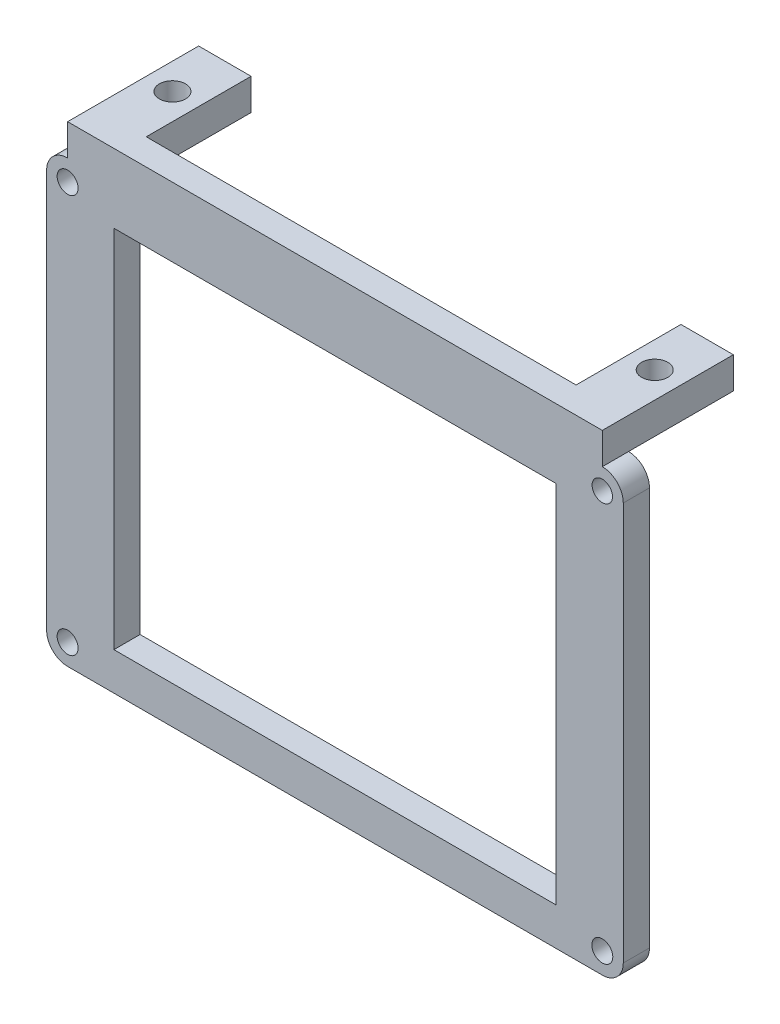
ISO-10303-21;
HEADER;
FILE_DESCRIPTION(('STEP AP214'),'2;1');
FILE_NAME('part.step','',(''),(''),'','','');
FILE_SCHEMA(('AUTOMOTIVE_DESIGN { 1 0 10303 214 1 1 1 1 }'));
ENDSEC;
DATA;
#1=APPLICATION_CONTEXT('core data for automotive mechanical design processes');
#2=APPLICATION_PROTOCOL_DEFINITION('international standard','automotive_design',2000,#1);
#3=PRODUCT_CONTEXT('',#1,'mechanical');
#4=PRODUCT('Part','Part','',(#3));
#5=PRODUCT_RELATED_PRODUCT_CATEGORY('part','',(#4));
#6=PRODUCT_DEFINITION_FORMATION('','',#4);
#7=PRODUCT_DEFINITION_CONTEXT('part definition',#1,'design');
#8=PRODUCT_DEFINITION('design','',#6,#7);
#9=PRODUCT_DEFINITION_SHAPE('','',#8);
#10=(LENGTH_UNIT() NAMED_UNIT(*) SI_UNIT(.MILLI.,.METRE.));
#11=(NAMED_UNIT(*) PLANE_ANGLE_UNIT() SI_UNIT($,.RADIAN.));
#12=(NAMED_UNIT(*) SI_UNIT($,.STERADIAN.) SOLID_ANGLE_UNIT());
#13=UNCERTAINTY_MEASURE_WITH_UNIT(LENGTH_MEASURE(1.E-05),#10,'distance_accuracy_value','');
#14=(GEOMETRIC_REPRESENTATION_CONTEXT(3) GLOBAL_UNCERTAINTY_ASSIGNED_CONTEXT((#13)) GLOBAL_UNIT_ASSIGNED_CONTEXT((#10,
#11,#12)) REPRESENTATION_CONTEXT('',''));
#15=CARTESIAN_POINT('',(0.,0.,0.));
#16=DIRECTION('',(0.,0.,1.));
#17=DIRECTION('',(1.,0.,0.));
#18=AXIS2_PLACEMENT_3D('',#15,#16,#17);
#19=CARTESIAN_POINT('',(67.9113573407202,23.2714681440443,5.));
#20=DIRECTION('',(0.,0.,-1.));
#21=DIRECTION('',(-1.,0.,0.));
#22=AXIS2_PLACEMENT_3D('',#19,#20,#21);
#23=PLANE('',#22);
#24=DIRECTION('',(-1.,0.,0.));
#25=VECTOR('',#24,1.);
#26=CARTESIAN_POINT('',(-25.261887482844,20.0825003663632,5.));
#27=LINE('',#26,#25);
#28=CARTESIAN_POINT('',(59.0846021642845,20.0825003663632,5.));
#29=VERTEX_POINT('',#28);
#30=CARTESIAN_POINT('',(-25.261887482844,20.0825003663632,5.));
#31=VERTEX_POINT('',#30);
#32=EDGE_CURVE('E177',#29,#31,#27,.T.);
#33=ORIENTED_EDGE('',*,*,#32,.F.);
#34=DIRECTION('',(0.,1.,0.));
#35=VECTOR('',#34,1.);
#36=CARTESIAN_POINT('',(59.0846021642845,20.0825003663632,5.));
#37=LINE('',#36,#35);
#38=CARTESIAN_POINT('',(59.0846021642845,-49.5395640782746,5.));
#39=VERTEX_POINT('',#38);
#40=EDGE_CURVE('E50',#39,#29,#37,.T.);
#41=ORIENTED_EDGE('',*,*,#40,.F.);
#42=DIRECTION('',(1.,0.,0.));
#43=VECTOR('',#42,1.);
#44=CARTESIAN_POINT('',(-25.261887482844,-49.5395640782746,5.));
#45=LINE('',#44,#43);
#46=CARTESIAN_POINT('',(-25.261887482844,-49.5395640782746,5.));
#47=VERTEX_POINT('',#46);
#48=EDGE_CURVE('E183',#47,#39,#45,.T.);
#49=ORIENTED_EDGE('',*,*,#48,.F.);
#50=DIRECTION('',(0.,-1.,0.));
#51=VECTOR('',#50,1.);
#52=CARTESIAN_POINT('',(-25.261887482844,20.0825003663632,5.));
#53=LINE('',#52,#51);
#54=EDGE_CURVE('E168',#31,#47,#53,.T.);
#55=ORIENTED_EDGE('',*,*,#54,.F.);
#56=EDGE_LOOP('',(#33,#41,#49,#55));
#57=FACE_BOUND('',#56,.T.);
#58=CARTESIAN_POINT('',(67.9113573407202,23.2714681440443,5.));
#59=DIRECTION('',(0.,0.,1.));
#60=DIRECTION('',(-1.,0.,0.));
#61=AXIS2_PLACEMENT_3D('',#58,#59,#60);
#62=CIRCLE('',#61,4.);
#63=CARTESIAN_POINT('',(71.9113573407202,23.2714681440443,5.));
#64=VERTEX_POINT('',#63);
#65=CARTESIAN_POINT('',(67.9113573407202,27.2714681440443,5.));
#66=VERTEX_POINT('',#65);
#67=EDGE_CURVE('E290',#64,#66,#62,.T.);
#68=ORIENTED_EDGE('',*,*,#67,.T.);
#69=DIRECTION('',(0.,-1.,0.));
#70=VECTOR('',#69,1.);
#71=CARTESIAN_POINT('',(67.9113573407202,33.2714681440443,5.));
#72=LINE('',#71,#70);
#73=CARTESIAN_POINT('',(67.9113573407202,33.2714681440443,5.));
#74=VERTEX_POINT('',#73);
#75=EDGE_CURVE('E258',#74,#66,#72,.T.);
#76=ORIENTED_EDGE('',*,*,#75,.F.);
#77=DIRECTION('',(1.,0.,0.));
#78=VECTOR('',#77,1.);
#79=CARTESIAN_POINT('',(0.,33.2714681440443,5.));
#80=LINE('',#79,#78);
#81=CARTESIAN_POINT('',(-34.0886426592797,33.2714681440443,5.));
#82=VERTEX_POINT('',#81);
#83=EDGE_CURVE('E200',#82,#74,#80,.T.);
#84=ORIENTED_EDGE('',*,*,#83,.F.);
#85=DIRECTION('',(0.,-1.,0.));
#86=VECTOR('',#85,1.);
#87=CARTESIAN_POINT('',(-34.0886426592797,33.2714681440443,5.));
#88=LINE('',#87,#86);
#89=CARTESIAN_POINT('',(-34.0886426592797,27.2714681440443,5.));
#90=VERTEX_POINT('',#89);
#91=EDGE_CURVE('E260',#82,#90,#88,.T.);
#92=ORIENTED_EDGE('',*,*,#91,.T.);
#93=CARTESIAN_POINT('',(-34.0886426592798,23.2714681440443,5.));
#94=DIRECTION('',(0.,0.,1.));
#95=DIRECTION('',(1.,0.,0.));
#96=AXIS2_PLACEMENT_3D('',#93,#94,#95);
#97=CIRCLE('',#96,4.);
#98=CARTESIAN_POINT('',(-38.0886426592798,23.2714681440443,5.));
#99=VERTEX_POINT('',#98);
#100=EDGE_CURVE('E293',#90,#99,#97,.T.);
#101=ORIENTED_EDGE('',*,*,#100,.T.);
#102=DIRECTION('',(0.,-1.,0.));
#103=VECTOR('',#102,1.);
#104=CARTESIAN_POINT('',(-38.0886426592798,23.2714681440443,5.));
#105=LINE('',#104,#103);
#106=CARTESIAN_POINT('',(-38.0886426592798,-52.7285318559557,5.));
#107=VERTEX_POINT('',#106);
#108=EDGE_CURVE('E296',#99,#107,#105,.T.);
#109=ORIENTED_EDGE('',*,*,#108,.T.);
#110=CARTESIAN_POINT('',(-34.0886426592798,-52.7285318559557,5.));
#111=DIRECTION('',(0.,0.,1.));
#112=DIRECTION('',(1.,0.,0.));
#113=AXIS2_PLACEMENT_3D('',#110,#111,#112);
#114=CIRCLE('',#113,4.);
#115=CARTESIAN_POINT('',(-34.0886426592797,-56.7285318559557,5.));
#116=VERTEX_POINT('',#115);
#117=EDGE_CURVE('E298',#107,#116,#114,.T.);
#118=ORIENTED_EDGE('',*,*,#117,.T.);
#119=DIRECTION('',(1.,0.,0.));
#120=VECTOR('',#119,1.);
#121=CARTESIAN_POINT('',(-34.0886426592797,-56.7285318559557,5.));
#122=LINE('',#121,#120);
#123=CARTESIAN_POINT('',(67.9113573407202,-56.7285318559557,5.));
#124=VERTEX_POINT('',#123);
#125=EDGE_CURVE('E300',#116,#124,#122,.T.);
#126=ORIENTED_EDGE('',*,*,#125,.T.);
#127=CARTESIAN_POINT('',(67.9113573407203,-52.7285318559557,5.));
#128=DIRECTION('',(0.,0.,1.));
#129=DIRECTION('',(1.,0.,0.));
#130=AXIS2_PLACEMENT_3D('',#127,#128,#129);
#131=CIRCLE('',#130,4.);
#132=CARTESIAN_POINT('',(71.9113573407203,-52.7285318559557,5.));
#133=VERTEX_POINT('',#132);
#134=EDGE_CURVE('E302',#124,#133,#131,.T.);
#135=ORIENTED_EDGE('',*,*,#134,.T.);
#136=DIRECTION('',(0.,1.,0.));
#137=VECTOR('',#136,1.);
#138=CARTESIAN_POINT('',(71.9113573407202,23.2714681440443,5.));
#139=LINE('',#138,#137);
#140=EDGE_CURVE('E304',#133,#64,#139,.T.);
#141=ORIENTED_EDGE('',*,*,#140,.T.);
#142=EDGE_LOOP('',(#68,#76,#84,#92,#101,#109,#118,#126,#135,#141));
#143=FACE_BOUND('',#142,.T.);
#144=CARTESIAN_POINT('',(67.9113573407202,23.2714681440443,5.));
#145=DIRECTION('',(0.,0.,1.));
#146=DIRECTION('',(1.,0.,0.));
#147=AXIS2_PLACEMENT_3D('',#144,#145,#146);
#148=CIRCLE('',#147,1.9459141915988);
#149=CARTESIAN_POINT('',(69.857271532319,23.2714681440443,5.));
#150=VERTEX_POINT('',#149);
#151=EDGE_CURVE('E284',#150,#150,#148,.T.);
#152=ORIENTED_EDGE('',*,*,#151,.F.);
#153=EDGE_LOOP('',(#152));
#154=FACE_BOUND('',#153,.T.);
#155=CARTESIAN_POINT('',(67.9113573407202,-52.7285318559557,5.));
#156=DIRECTION('',(0.,0.,1.));
#157=DIRECTION('',(1.,0.,0.));
#158=AXIS2_PLACEMENT_3D('',#155,#156,#157);
#159=CIRCLE('',#158,2.);
#160=CARTESIAN_POINT('',(69.9113573407202,-52.7285318559557,5.));
#161=VERTEX_POINT('',#160);
#162=EDGE_CURVE('E278',#161,#161,#159,.T.);
#163=ORIENTED_EDGE('',*,*,#162,.F.);
#164=EDGE_LOOP('',(#163));
#165=FACE_BOUND('',#164,.T.);
#166=CARTESIAN_POINT('',(-34.0886426592797,23.2714681440443,5.));
#167=DIRECTION('',(0.,0.,1.));
#168=DIRECTION('',(1.,0.,0.));
#169=AXIS2_PLACEMENT_3D('',#166,#167,#168);
#170=CIRCLE('',#169,2.);
#171=CARTESIAN_POINT('',(-32.0886426592797,23.2714681440443,5.));
#172=VERTEX_POINT('',#171);
#173=EDGE_CURVE('E272',#172,#172,#170,.T.);
#174=ORIENTED_EDGE('',*,*,#173,.F.);
#175=EDGE_LOOP('',(#174));
#176=FACE_BOUND('',#175,.T.);
#177=CARTESIAN_POINT('',(-34.0886426592797,-52.7285318559557,5.));
#178=DIRECTION('',(0.,0.,1.));
#179=DIRECTION('',(1.,0.,0.));
#180=AXIS2_PLACEMENT_3D('',#177,#178,#179);
#181=CIRCLE('',#180,2.);
#182=CARTESIAN_POINT('',(-32.0886426592797,-52.7285318559557,5.));
#183=VERTEX_POINT('',#182);
#184=EDGE_CURVE('E266',#183,#183,#181,.T.);
#185=ORIENTED_EDGE('',*,*,#184,.F.);
#186=EDGE_LOOP('',(#185));
#187=FACE_BOUND('',#186,.T.);
#188=ADVANCED_FACE('F35',(#57,#143,#154,#165,#176,#187),#23,.F.);
#189=CARTESIAN_POINT('',(67.9113573407202,23.2714681440443,0.));
#190=DIRECTION('',(0.,0.,-1.));
#191=DIRECTION('',(-1.,0.,0.));
#192=AXIS2_PLACEMENT_3D('',#189,#190,#191);
#193=PLANE('',#192);
#194=DIRECTION('',(0.,-1.,0.));
#195=VECTOR('',#194,1.);
#196=CARTESIAN_POINT('',(59.0846021642845,23.2714681440443,0.));
#197=LINE('',#196,#195);
#198=CARTESIAN_POINT('',(59.0846021642845,20.0825003663632,0.));
#199=VERTEX_POINT('',#198);
#200=CARTESIAN_POINT('',(59.0846021642845,-49.5395640782746,0.));
#201=VERTEX_POINT('',#200);
#202=EDGE_CURVE('E11',#199,#201,#197,.T.);
#203=ORIENTED_EDGE('',*,*,#202,.F.);
#204=DIRECTION('',(1.,0.,0.));
#205=VECTOR('',#204,1.);
#206=CARTESIAN_POINT('',(67.9113573407202,20.0825003663632,0.));
#207=LINE('',#206,#205);
#208=CARTESIAN_POINT('',(-25.261887482844,20.0825003663632,0.));
#209=VERTEX_POINT('',#208);
#210=EDGE_CURVE('E345',#209,#199,#207,.T.);
#211=ORIENTED_EDGE('',*,*,#210,.F.);
#212=DIRECTION('',(0.,1.,0.));
#213=VECTOR('',#212,1.);
#214=CARTESIAN_POINT('',(-25.261887482844,23.2714681440443,0.));
#215=LINE('',#214,#213);
#216=CARTESIAN_POINT('',(-25.261887482844,-49.5395640782746,0.));
#217=VERTEX_POINT('',#216);
#218=EDGE_CURVE('E171',#217,#209,#215,.T.);
#219=ORIENTED_EDGE('',*,*,#218,.F.);
#220=DIRECTION('',(-1.,0.,0.));
#221=VECTOR('',#220,1.);
#222=CARTESIAN_POINT('',(67.9113573407202,-49.5395640782746,0.));
#223=LINE('',#222,#221);
#224=EDGE_CURVE('E43',#201,#217,#223,.T.);
#225=ORIENTED_EDGE('',*,*,#224,.F.);
#226=EDGE_LOOP('',(#203,#211,#219,#225));
#227=FACE_BOUND('',#226,.T.);
#228=CARTESIAN_POINT('',(-34.0886426592797,23.2714681440443,0.));
#229=DIRECTION('',(0.,0.,1.));
#230=DIRECTION('',(1.,0.,0.));
#231=AXIS2_PLACEMENT_3D('',#228,#229,#230);
#232=CIRCLE('',#231,2.);
#233=CARTESIAN_POINT('',(-32.0886426592797,23.2714681440443,0.));
#234=VERTEX_POINT('',#233);
#235=EDGE_CURVE('E269',#234,#234,#232,.T.);
#236=ORIENTED_EDGE('',*,*,#235,.T.);
#237=EDGE_LOOP('',(#236));
#238=FACE_BOUND('',#237,.T.);
#239=CARTESIAN_POINT('',(67.9113573407202,23.2714681440443,0.));
#240=DIRECTION('',(0.,0.,1.));
#241=DIRECTION('',(1.,0.,0.));
#242=AXIS2_PLACEMENT_3D('',#239,#240,#241);
#243=CIRCLE('',#242,1.9459141915988);
#244=CARTESIAN_POINT('',(69.857271532319,23.2714681440443,0.));
#245=VERTEX_POINT('',#244);
#246=EDGE_CURVE('E281',#245,#245,#243,.T.);
#247=ORIENTED_EDGE('',*,*,#246,.T.);
#248=EDGE_LOOP('',(#247));
#249=FACE_BOUND('',#248,.T.);
#250=CARTESIAN_POINT('',(67.9113573407202,23.2714681440443,0.));
#251=DIRECTION('',(0.,0.,1.));
#252=DIRECTION('',(-1.,0.,0.));
#253=AXIS2_PLACEMENT_3D('',#250,#251,#252);
#254=CIRCLE('',#253,4.);
#255=CARTESIAN_POINT('',(71.9113573407202,23.2714681440443,0.));
#256=VERTEX_POINT('',#255);
#257=CARTESIAN_POINT('',(67.9113573407202,27.2714681440443,0.));
#258=VERTEX_POINT('',#257);
#259=EDGE_CURVE('E287',#256,#258,#254,.T.);
#260=ORIENTED_EDGE('',*,*,#259,.F.);
#261=DIRECTION('',(0.,1.,0.));
#262=VECTOR('',#261,1.);
#263=CARTESIAN_POINT('',(71.9113573407202,23.2714681440443,0.));
#264=LINE('',#263,#262);
#265=CARTESIAN_POINT('',(71.9113573407203,-52.7285318559557,0.));
#266=VERTEX_POINT('',#265);
#267=EDGE_CURVE('E294',#266,#256,#264,.T.);
#268=ORIENTED_EDGE('',*,*,#267,.F.);
#269=CARTESIAN_POINT('',(67.9113573407203,-52.7285318559557,0.));
#270=DIRECTION('',(0.,0.,1.));
#271=DIRECTION('',(1.,0.,0.));
#272=AXIS2_PLACEMENT_3D('',#269,#270,#271);
#273=CIRCLE('',#272,4.);
#274=CARTESIAN_POINT('',(67.9113573407202,-56.7285318559557,0.));
#275=VERTEX_POINT('',#274);
#276=EDGE_CURVE('E319',#275,#266,#273,.T.);
#277=ORIENTED_EDGE('',*,*,#276,.F.);
#278=DIRECTION('',(1.,0.,0.));
#279=VECTOR('',#278,1.);
#280=CARTESIAN_POINT('',(-34.0886426592797,-56.7285318559557,0.));
#281=LINE('',#280,#279);
#282=CARTESIAN_POINT('',(-34.0886426592797,-56.7285318559557,0.));
#283=VERTEX_POINT('',#282);
#284=EDGE_CURVE('E317',#283,#275,#281,.T.);
#285=ORIENTED_EDGE('',*,*,#284,.F.);
#286=CARTESIAN_POINT('',(-34.0886426592798,-52.7285318559557,0.));
#287=DIRECTION('',(0.,0.,1.));
#288=DIRECTION('',(1.,0.,0.));
#289=AXIS2_PLACEMENT_3D('',#286,#287,#288);
#290=CIRCLE('',#289,4.);
#291=CARTESIAN_POINT('',(-38.0886426592798,-52.7285318559557,0.));
#292=VERTEX_POINT('',#291);
#293=EDGE_CURVE('E315',#292,#283,#290,.T.);
#294=ORIENTED_EDGE('',*,*,#293,.F.);
#295=DIRECTION('',(0.,-1.,0.));
#296=VECTOR('',#295,1.);
#297=CARTESIAN_POINT('',(-38.0886426592798,23.2714681440443,0.));
#298=LINE('',#297,#296);
#299=CARTESIAN_POINT('',(-38.0886426592798,23.2714681440443,0.));
#300=VERTEX_POINT('',#299);
#301=EDGE_CURVE('E313',#300,#292,#298,.T.);
#302=ORIENTED_EDGE('',*,*,#301,.F.);
#303=CARTESIAN_POINT('',(-34.0886426592798,23.2714681440443,0.));
#304=DIRECTION('',(0.,0.,1.));
#305=DIRECTION('',(1.,0.,0.));
#306=AXIS2_PLACEMENT_3D('',#303,#304,#305);
#307=CIRCLE('',#306,4.);
#308=CARTESIAN_POINT('',(-34.0886426592797,27.2714681440443,0.));
#309=VERTEX_POINT('',#308);
#310=EDGE_CURVE('E311',#309,#300,#307,.T.);
#311=ORIENTED_EDGE('',*,*,#310,.F.);
#312=DIRECTION('',(1.,0.,0.));
#313=VECTOR('',#312,1.);
#314=CARTESIAN_POINT('',(67.9113573407202,27.2714681440443,0.));
#315=LINE('',#314,#313);
#316=CARTESIAN_POINT('',(-24.0886426592797,27.2714681440443,0.));
#317=VERTEX_POINT('',#316);
#318=EDGE_CURVE('E262',#309,#317,#315,.T.);
#319=ORIENTED_EDGE('',*,*,#318,.T.);
#320=DIRECTION('',(0.,-1.,0.));
#321=VECTOR('',#320,1.);
#322=CARTESIAN_POINT('',(-24.0886426592797,33.2714681440443,0.));
#323=LINE('',#322,#321);
#324=CARTESIAN_POINT('',(-24.0886426592797,33.2714681440443,0.));
#325=VERTEX_POINT('',#324);
#326=EDGE_CURVE('E247',#325,#317,#323,.T.);
#327=ORIENTED_EDGE('',*,*,#326,.F.);
#328=DIRECTION('',(-1.,0.,0.));
#329=VECTOR('',#328,1.);
#330=CARTESIAN_POINT('',(0.,33.2714681440443,0.));
#331=LINE('',#330,#329);
#332=CARTESIAN_POINT('',(57.9113573407202,33.2714681440443,0.));
#333=VERTEX_POINT('',#332);
#334=EDGE_CURVE('E211',#333,#325,#331,.T.);
#335=ORIENTED_EDGE('',*,*,#334,.F.);
#336=DIRECTION('',(0.,-1.,0.));
#337=VECTOR('',#336,1.);
#338=CARTESIAN_POINT('',(57.9113573407202,33.2714681440443,0.));
#339=LINE('',#338,#337);
#340=CARTESIAN_POINT('',(57.9113573407202,27.2714681440443,0.));
#341=VERTEX_POINT('',#340);
#342=EDGE_CURVE('E250',#333,#341,#339,.T.);
#343=ORIENTED_EDGE('',*,*,#342,.T.);
#344=DIRECTION('',(-1.,0.,0.));
#345=VECTOR('',#344,1.);
#346=CARTESIAN_POINT('',(-34.0886426592797,27.2714681440443,0.));
#347=LINE('',#346,#345);
#348=EDGE_CURVE('E309',#258,#341,#347,.T.);
#349=ORIENTED_EDGE('',*,*,#348,.F.);
#350=EDGE_LOOP('',(#260,#268,#277,#285,#294,#302,#311,#319,#327,#335,#343,#349));
#351=FACE_BOUND('',#350,.T.);
#352=CARTESIAN_POINT('',(67.9113573407202,-52.7285318559557,0.));
#353=DIRECTION('',(0.,0.,1.));
#354=DIRECTION('',(1.,0.,0.));
#355=AXIS2_PLACEMENT_3D('',#352,#353,#354);
#356=CIRCLE('',#355,2.);
#357=CARTESIAN_POINT('',(69.9113573407202,-52.7285318559557,0.));
#358=VERTEX_POINT('',#357);
#359=EDGE_CURVE('E275',#358,#358,#356,.T.);
#360=ORIENTED_EDGE('',*,*,#359,.T.);
#361=EDGE_LOOP('',(#360));
#362=FACE_BOUND('',#361,.T.);
#363=CARTESIAN_POINT('',(-34.0886426592797,-52.7285318559557,0.));
#364=DIRECTION('',(0.,0.,1.));
#365=DIRECTION('',(1.,0.,0.));
#366=AXIS2_PLACEMENT_3D('',#363,#364,#365);
#367=CIRCLE('',#366,2.);
#368=CARTESIAN_POINT('',(-32.0886426592797,-52.7285318559557,0.));
#369=VERTEX_POINT('',#368);
#370=EDGE_CURVE('E265',#369,#369,#367,.T.);
#371=ORIENTED_EDGE('',*,*,#370,.T.);
#372=EDGE_LOOP('',(#371));
#373=FACE_BOUND('',#372,.T.);
#374=ADVANCED_FACE('F353',(#227,#238,#249,#351,#362,#373),#193,.T.);
#375=CARTESIAN_POINT('',(67.9113573407202,23.2714681440443,5.));
#376=DIRECTION('',(0.,0.,-1.));
#377=DIRECTION('',(-1.,0.,0.));
#378=AXIS2_PLACEMENT_3D('',#375,#376,#377);
#379=CYLINDRICAL_SURFACE('',#378,4.);
#380=ORIENTED_EDGE('',*,*,#259,.T.);
#381=DIRECTION('',(0.,0.,-1.));
#382=VECTOR('',#381,1.);
#383=CARTESIAN_POINT('',(67.9113573407202,27.2714681440443,5.));
#384=LINE('',#383,#382);
#385=EDGE_CURVE('E342',#66,#258,#384,.T.);
#386=ORIENTED_EDGE('',*,*,#385,.F.);
#387=ORIENTED_EDGE('',*,*,#67,.F.);
#388=DIRECTION('',(0.,0.,-1.));
#389=VECTOR('',#388,1.);
#390=CARTESIAN_POINT('',(71.9113573407202,23.2714681440443,5.));
#391=LINE('',#390,#389);
#392=EDGE_CURVE('E306',#64,#256,#391,.T.);
#393=ORIENTED_EDGE('',*,*,#392,.T.);
#394=EDGE_LOOP('',(#380,#386,#387,#393));
#395=FACE_BOUND('',#394,.T.);
#396=ADVANCED_FACE('F37',(#395),#379,.T.);
#397=CARTESIAN_POINT('',(-34.0886426592798,23.2714681440443,5.));
#398=DIRECTION('',(0.,0.,-1.));
#399=DIRECTION('',(-1.,0.,0.));
#400=AXIS2_PLACEMENT_3D('',#397,#398,#399);
#401=CYLINDRICAL_SURFACE('',#400,4.);
#402=ORIENTED_EDGE('',*,*,#310,.T.);
#403=DIRECTION('',(0.,0.,-1.));
#404=VECTOR('',#403,1.);
#405=CARTESIAN_POINT('',(-38.0886426592798,23.2714681440443,5.));
#406=LINE('',#405,#404);
#407=EDGE_CURVE('E336',#99,#300,#406,.T.);
#408=ORIENTED_EDGE('',*,*,#407,.F.);
#409=ORIENTED_EDGE('',*,*,#100,.F.);
#410=DIRECTION('',(0.,0.,-1.));
#411=VECTOR('',#410,1.);
#412=CARTESIAN_POINT('',(-34.0886426592797,27.2714681440443,5.));
#413=LINE('',#412,#411);
#414=EDGE_CURVE('E339',#90,#309,#413,.T.);
#415=ORIENTED_EDGE('',*,*,#414,.T.);
#416=EDGE_LOOP('',(#402,#408,#409,#415));
#417=FACE_BOUND('',#416,.T.);
#418=ADVANCED_FACE('F398',(#417),#401,.T.);
#419=CARTESIAN_POINT('',(-38.0886426592798,23.2714681440443,5.));
#420=DIRECTION('',(1.,0.,0.));
#421=DIRECTION('',(0.,0.,-1.));
#422=AXIS2_PLACEMENT_3D('',#419,#420,#421);
#423=PLANE('',#422);
#424=ORIENTED_EDGE('',*,*,#301,.T.);
#425=DIRECTION('',(0.,0.,-1.));
#426=VECTOR('',#425,1.);
#427=CARTESIAN_POINT('',(-38.0886426592798,-52.7285318559557,5.));
#428=LINE('',#427,#426);
#429=EDGE_CURVE('E333',#107,#292,#428,.T.);
#430=ORIENTED_EDGE('',*,*,#429,.F.);
#431=ORIENTED_EDGE('',*,*,#108,.F.);
#432=ORIENTED_EDGE('',*,*,#407,.T.);
#433=EDGE_LOOP('',(#424,#430,#431,#432));
#434=FACE_BOUND('',#433,.T.);
#435=ADVANCED_FACE('F395',(#434),#423,.F.);
#436=CARTESIAN_POINT('',(-34.0886426592798,-52.7285318559557,5.));
#437=DIRECTION('',(0.,0.,-1.));
#438=DIRECTION('',(-1.,0.,0.));
#439=AXIS2_PLACEMENT_3D('',#436,#437,#438);
#440=CYLINDRICAL_SURFACE('',#439,4.);
#441=ORIENTED_EDGE('',*,*,#293,.T.);
#442=DIRECTION('',(0.,0.,-1.));
#443=VECTOR('',#442,1.);
#444=CARTESIAN_POINT('',(-34.0886426592797,-56.7285318559557,5.));
#445=LINE('',#444,#443);
#446=EDGE_CURVE('E330',#116,#283,#445,.T.);
#447=ORIENTED_EDGE('',*,*,#446,.F.);
#448=ORIENTED_EDGE('',*,*,#117,.F.);
#449=ORIENTED_EDGE('',*,*,#429,.T.);
#450=EDGE_LOOP('',(#441,#447,#448,#449));
#451=FACE_BOUND('',#450,.T.);
#452=ADVANCED_FACE('F391',(#451),#440,.T.);
#453=CARTESIAN_POINT('',(-34.0886426592797,-56.7285318559557,5.));
#454=DIRECTION('',(0.,1.,0.));
#455=DIRECTION('',(0.,0.,1.));
#456=AXIS2_PLACEMENT_3D('',#453,#454,#455);
#457=PLANE('',#456);
#458=ORIENTED_EDGE('',*,*,#284,.T.);
#459=DIRECTION('',(0.,0.,-1.));
#460=VECTOR('',#459,1.);
#461=CARTESIAN_POINT('',(67.9113573407202,-56.7285318559557,5.));
#462=LINE('',#461,#460);
#463=EDGE_CURVE('E327',#124,#275,#462,.T.);
#464=ORIENTED_EDGE('',*,*,#463,.F.);
#465=ORIENTED_EDGE('',*,*,#125,.F.);
#466=ORIENTED_EDGE('',*,*,#446,.T.);
#467=EDGE_LOOP('',(#458,#464,#465,#466));
#468=FACE_BOUND('',#467,.T.);
#469=ADVANCED_FACE('F387',(#468),#457,.F.);
#470=CARTESIAN_POINT('',(67.9113573407203,-52.7285318559557,5.));
#471=DIRECTION('',(0.,0.,-1.));
#472=DIRECTION('',(-1.,0.,0.));
#473=AXIS2_PLACEMENT_3D('',#470,#471,#472);
#474=CYLINDRICAL_SURFACE('',#473,4.);
#475=ORIENTED_EDGE('',*,*,#276,.T.);
#476=DIRECTION('',(0.,0.,-1.));
#477=VECTOR('',#476,1.);
#478=CARTESIAN_POINT('',(71.9113573407203,-52.7285318559557,5.));
#479=LINE('',#478,#477);
#480=EDGE_CURVE('E324',#133,#266,#479,.T.);
#481=ORIENTED_EDGE('',*,*,#480,.F.);
#482=ORIENTED_EDGE('',*,*,#134,.F.);
#483=ORIENTED_EDGE('',*,*,#463,.T.);
#484=EDGE_LOOP('',(#475,#481,#482,#483));
#485=FACE_BOUND('',#484,.T.);
#486=ADVANCED_FACE('F383',(#485),#474,.T.);
#487=CARTESIAN_POINT('',(71.9113573407202,23.2714681440443,5.));
#488=DIRECTION('',(-1.,0.,0.));
#489=DIRECTION('',(0.,-1.,0.));
#490=AXIS2_PLACEMENT_3D('',#487,#488,#489);
#491=PLANE('',#490);
#492=ORIENTED_EDGE('',*,*,#267,.T.);
#493=ORIENTED_EDGE('',*,*,#392,.F.);
#494=ORIENTED_EDGE('',*,*,#140,.F.);
#495=ORIENTED_EDGE('',*,*,#480,.T.);
#496=EDGE_LOOP('',(#492,#493,#494,#495));
#497=FACE_BOUND('',#496,.T.);
#498=ADVANCED_FACE('F380',(#497),#491,.F.);
#499=CARTESIAN_POINT('',(67.9113573407202,23.2714681440443,5.));
#500=DIRECTION('',(0.,0.,-1.));
#501=DIRECTION('',(-1.,0.,0.));
#502=AXIS2_PLACEMENT_3D('',#499,#500,#501);
#503=CYLINDRICAL_SURFACE('',#502,1.9459141915988);
#504=ORIENTED_EDGE('',*,*,#151,.T.);
#505=EDGE_LOOP('',(#504));
#506=FACE_BOUND('',#505,.T.);
#507=ORIENTED_EDGE('',*,*,#246,.F.);
#508=EDGE_LOOP('',(#507));
#509=FACE_BOUND('',#508,.T.);
#510=ADVANCED_FACE('F377',(#506,#509),#503,.F.);
#511=CARTESIAN_POINT('',(67.9113573407202,-52.7285318559557,5.));
#512=DIRECTION('',(0.,0.,-1.));
#513=DIRECTION('',(-1.,0.,0.));
#514=AXIS2_PLACEMENT_3D('',#511,#512,#513);
#515=CYLINDRICAL_SURFACE('',#514,2.);
#516=ORIENTED_EDGE('',*,*,#162,.T.);
#517=EDGE_LOOP('',(#516));
#518=FACE_BOUND('',#517,.T.);
#519=ORIENTED_EDGE('',*,*,#359,.F.);
#520=EDGE_LOOP('',(#519));
#521=FACE_BOUND('',#520,.T.);
#522=ADVANCED_FACE('F488',(#518,#521),#515,.F.);
#523=CARTESIAN_POINT('',(-34.0886426592797,23.2714681440443,5.));
#524=DIRECTION('',(0.,0.,-1.));
#525=DIRECTION('',(-1.,0.,0.));
#526=AXIS2_PLACEMENT_3D('',#523,#524,#525);
#527=CYLINDRICAL_SURFACE('',#526,2.);
#528=ORIENTED_EDGE('',*,*,#173,.T.);
#529=EDGE_LOOP('',(#528));
#530=FACE_BOUND('',#529,.T.);
#531=ORIENTED_EDGE('',*,*,#235,.F.);
#532=EDGE_LOOP('',(#531));
#533=FACE_BOUND('',#532,.T.);
#534=ADVANCED_FACE('F485',(#530,#533),#527,.F.);
#535=CARTESIAN_POINT('',(-34.0886426592797,-52.7285318559557,5.));
#536=DIRECTION('',(0.,0.,-1.));
#537=DIRECTION('',(-1.,0.,0.));
#538=AXIS2_PLACEMENT_3D('',#535,#536,#537);
#539=CYLINDRICAL_SURFACE('',#538,2.);
#540=ORIENTED_EDGE('',*,*,#184,.T.);
#541=EDGE_LOOP('',(#540));
#542=FACE_BOUND('',#541,.T.);
#543=ORIENTED_EDGE('',*,*,#370,.F.);
#544=EDGE_LOOP('',(#543));
#545=FACE_BOUND('',#544,.T.);
#546=ADVANCED_FACE('F482',(#542,#545),#539,.F.);
#547=CARTESIAN_POINT('',(0.,27.2714681440443,0.));
#548=DIRECTION('',(0.,1.,0.));
#549=DIRECTION('',(0.,0.,1.));
#550=AXIS2_PLACEMENT_3D('',#547,#548,#549);
#551=PLANE('',#550);
#552=ORIENTED_EDGE('',*,*,#318,.F.);
#553=DIRECTION('',(0.,0.,-1.));
#554=VECTOR('',#553,1.);
#555=CARTESIAN_POINT('',(-34.0886426592797,27.2714681440443,0.));
#556=LINE('',#555,#554);
#557=CARTESIAN_POINT('',(-34.0886426592797,27.2714681440443,-20.));
#558=VERTEX_POINT('',#557);
#559=EDGE_CURVE('E225',#309,#558,#556,.T.);
#560=ORIENTED_EDGE('',*,*,#559,.T.);
#561=DIRECTION('',(1.,0.,0.));
#562=VECTOR('',#561,1.);
#563=CARTESIAN_POINT('',(0.,27.2714681440443,-20.));
#564=LINE('',#563,#562);
#565=CARTESIAN_POINT('',(-24.0886426592797,27.2714681440443,-20.));
#566=VERTEX_POINT('',#565);
#567=EDGE_CURVE('E238',#558,#566,#564,.T.);
#568=ORIENTED_EDGE('',*,*,#567,.T.);
#569=DIRECTION('',(0.,0.,-1.));
#570=VECTOR('',#569,1.);
#571=CARTESIAN_POINT('',(-24.0886426592797,27.2714681440443,0.));
#572=LINE('',#571,#570);
#573=EDGE_CURVE('E235',#317,#566,#572,.T.);
#574=ORIENTED_EDGE('',*,*,#573,.F.);
#575=EDGE_LOOP('',(#552,#560,#568,#574));
#576=FACE_BOUND('',#575,.T.);
#577=CARTESIAN_POINT('',(-29.0886426592797,27.2714681440443,-10.));
#578=DIRECTION('',(0.,1.,0.));
#579=DIRECTION('',(0.,0.,1.));
#580=AXIS2_PLACEMENT_3D('',#577,#578,#579);
#581=CIRCLE('',#580,2.5);
#582=CARTESIAN_POINT('',(-29.0886426592797,27.2714681440443,-7.5));
#583=VERTEX_POINT('',#582);
#584=EDGE_CURVE('E190',#583,#583,#581,.T.);
#585=ORIENTED_EDGE('',*,*,#584,.T.);
#586=EDGE_LOOP('',(#585));
#587=FACE_BOUND('',#586,.T.);
#588=ADVANCED_FACE('F367',(#576,#587),#551,.F.);
#589=CARTESIAN_POINT('',(-34.0886426592797,33.2714681440443,0.));
#590=DIRECTION('',(-1.,0.,0.));
#591=DIRECTION('',(0.,0.,1.));
#592=AXIS2_PLACEMENT_3D('',#589,#590,#591);
#593=PLANE('',#592);
#594=ORIENTED_EDGE('',*,*,#414,.F.);
#595=ORIENTED_EDGE('',*,*,#91,.F.);
#596=DIRECTION('',(0.,0.,-1.));
#597=VECTOR('',#596,1.);
#598=CARTESIAN_POINT('',(-34.0886426592797,33.2714681440443,0.));
#599=LINE('',#598,#597);
#600=CARTESIAN_POINT('',(-34.0886426592797,33.2714681440443,-20.));
#601=VERTEX_POINT('',#600);
#602=EDGE_CURVE('E196',#82,#601,#599,.T.);
#603=ORIENTED_EDGE('',*,*,#602,.T.);
#604=DIRECTION('',(0.,-1.,0.));
#605=VECTOR('',#604,1.);
#606=CARTESIAN_POINT('',(-34.0886426592797,33.2714681440443,-20.));
#607=LINE('',#606,#605);
#608=EDGE_CURVE('E222',#601,#558,#607,.T.);
#609=ORIENTED_EDGE('',*,*,#608,.T.);
#610=ORIENTED_EDGE('',*,*,#559,.F.);
#611=EDGE_LOOP('',(#594,#595,#603,#609,#610));
#612=FACE_BOUND('',#611,.T.);
#613=ADVANCED_FACE('F430',(#612),#593,.T.);
#614=CARTESIAN_POINT('',(67.9113573407202,33.2714681440443,0.));
#615=DIRECTION('',(-1.,0.,0.));
#616=DIRECTION('',(0.,0.,1.));
#617=AXIS2_PLACEMENT_3D('',#614,#615,#616);
#618=PLANE('',#617);
#619=ORIENTED_EDGE('',*,*,#385,.T.);
#620=DIRECTION('',(0.,0.,-1.));
#621=VECTOR('',#620,1.);
#622=CARTESIAN_POINT('',(67.9113573407202,27.2714681440443,0.));
#623=LINE('',#622,#621);
#624=CARTESIAN_POINT('',(67.9113573407202,27.2714681440443,-20.));
#625=VERTEX_POINT('',#624);
#626=EDGE_CURVE('E227',#258,#625,#623,.T.);
#627=ORIENTED_EDGE('',*,*,#626,.T.);
#628=DIRECTION('',(0.,-1.,0.));
#629=VECTOR('',#628,1.);
#630=CARTESIAN_POINT('',(67.9113573407202,33.2714681440443,-20.));
#631=LINE('',#630,#629);
#632=CARTESIAN_POINT('',(67.9113573407202,33.2714681440443,-20.));
#633=VERTEX_POINT('',#632);
#634=EDGE_CURVE('E255',#633,#625,#631,.T.);
#635=ORIENTED_EDGE('',*,*,#634,.F.);
#636=DIRECTION('',(0.,0.,-1.));
#637=VECTOR('',#636,1.);
#638=CARTESIAN_POINT('',(67.9113573407202,33.2714681440443,0.));
#639=LINE('',#638,#637);
#640=EDGE_CURVE('E203',#74,#633,#639,.T.);
#641=ORIENTED_EDGE('',*,*,#640,.F.);
#642=ORIENTED_EDGE('',*,*,#75,.T.);
#643=EDGE_LOOP('',(#619,#627,#635,#641,#642));
#644=FACE_BOUND('',#643,.T.);
#645=ADVANCED_FACE('F455',(#644),#618,.F.);
#646=CARTESIAN_POINT('',(0.,33.2714681440443,-20.));
#647=DIRECTION('',(0.,0.,1.));
#648=DIRECTION('',(1.,0.,0.));
#649=AXIS2_PLACEMENT_3D('',#646,#647,#648);
#650=PLANE('',#649);
#651=DIRECTION('',(-1.,0.,0.));
#652=VECTOR('',#651,1.);
#653=CARTESIAN_POINT('',(0.,27.2714681440443,-20.));
#654=LINE('',#653,#652);
#655=CARTESIAN_POINT('',(57.9113573407202,27.2714681440443,-20.));
#656=VERTEX_POINT('',#655);
#657=EDGE_CURVE('E229',#625,#656,#654,.T.);
#658=ORIENTED_EDGE('',*,*,#657,.T.);
#659=DIRECTION('',(0.,-1.,0.));
#660=VECTOR('',#659,1.);
#661=CARTESIAN_POINT('',(57.9113573407202,33.2714681440443,-20.));
#662=LINE('',#661,#660);
#663=CARTESIAN_POINT('',(57.9113573407202,33.2714681440443,-20.));
#664=VERTEX_POINT('',#663);
#665=EDGE_CURVE('E253',#664,#656,#662,.T.);
#666=ORIENTED_EDGE('',*,*,#665,.F.);
#667=DIRECTION('',(-1.,0.,0.));
#668=VECTOR('',#667,1.);
#669=CARTESIAN_POINT('',(0.,33.2714681440443,-20.));
#670=LINE('',#669,#668);
#671=EDGE_CURVE('E206',#633,#664,#670,.T.);
#672=ORIENTED_EDGE('',*,*,#671,.F.);
#673=ORIENTED_EDGE('',*,*,#634,.T.);
#674=EDGE_LOOP('',(#658,#666,#672,#673));
#675=FACE_BOUND('',#674,.T.);
#676=ADVANCED_FACE('F474',(#675),#650,.F.);
#677=CARTESIAN_POINT('',(57.9113573407202,33.2714681440443,0.));
#678=DIRECTION('',(-1.,0.,0.));
#679=DIRECTION('',(0.,0.,1.));
#680=AXIS2_PLACEMENT_3D('',#677,#678,#679);
#681=PLANE('',#680);
#682=DIRECTION('',(0.,0.,-1.));
#683=VECTOR('',#682,1.);
#684=CARTESIAN_POINT('',(57.9113573407202,27.2714681440443,0.));
#685=LINE('',#684,#683);
#686=EDGE_CURVE('E232',#341,#656,#685,.T.);
#687=ORIENTED_EDGE('',*,*,#686,.F.);
#688=ORIENTED_EDGE('',*,*,#342,.F.);
#689=DIRECTION('',(0.,0.,-1.));
#690=VECTOR('',#689,1.);
#691=CARTESIAN_POINT('',(57.9113573407202,33.2714681440443,0.));
#692=LINE('',#691,#690);
#693=EDGE_CURVE('E208',#333,#664,#692,.T.);
#694=ORIENTED_EDGE('',*,*,#693,.T.);
#695=ORIENTED_EDGE('',*,*,#665,.T.);
#696=EDGE_LOOP('',(#687,#688,#694,#695));
#697=FACE_BOUND('',#696,.T.);
#698=ADVANCED_FACE('F447',(#697),#681,.T.);
#699=CARTESIAN_POINT('',(-24.0886426592797,33.2714681440443,0.));
#700=DIRECTION('',(-1.,0.,0.));
#701=DIRECTION('',(0.,0.,1.));
#702=AXIS2_PLACEMENT_3D('',#699,#700,#701);
#703=PLANE('',#702);
#704=ORIENTED_EDGE('',*,*,#573,.T.);
#705=DIRECTION('',(0.,-1.,0.));
#706=VECTOR('',#705,1.);
#707=CARTESIAN_POINT('',(-24.0886426592797,33.2714681440443,-20.));
#708=LINE('',#707,#706);
#709=CARTESIAN_POINT('',(-24.0886426592797,33.2714681440443,-20.));
#710=VERTEX_POINT('',#709);
#711=EDGE_CURVE('E245',#710,#566,#708,.T.);
#712=ORIENTED_EDGE('',*,*,#711,.F.);
#713=DIRECTION('',(0.,0.,-1.));
#714=VECTOR('',#713,1.);
#715=CARTESIAN_POINT('',(-24.0886426592797,33.2714681440443,0.));
#716=LINE('',#715,#714);
#717=EDGE_CURVE('E214',#325,#710,#716,.T.);
#718=ORIENTED_EDGE('',*,*,#717,.F.);
#719=ORIENTED_EDGE('',*,*,#326,.T.);
#720=EDGE_LOOP('',(#704,#712,#718,#719));
#721=FACE_BOUND('',#720,.T.);
#722=ADVANCED_FACE('F439',(#721),#703,.F.);
#723=CARTESIAN_POINT('',(0.,33.2714681440443,-20.));
#724=DIRECTION('',(0.,0.,-1.));
#725=DIRECTION('',(-1.,0.,0.));
#726=AXIS2_PLACEMENT_3D('',#723,#724,#725);
#727=PLANE('',#726);
#728=ORIENTED_EDGE('',*,*,#567,.F.);
#729=ORIENTED_EDGE('',*,*,#608,.F.);
#730=DIRECTION('',(1.,0.,0.));
#731=VECTOR('',#730,1.);
#732=CARTESIAN_POINT('',(0.,33.2714681440443,-20.));
#733=LINE('',#732,#731);
#734=EDGE_CURVE('E216',#601,#710,#733,.T.);
#735=ORIENTED_EDGE('',*,*,#734,.T.);
#736=ORIENTED_EDGE('',*,*,#711,.T.);
#737=EDGE_LOOP('',(#728,#729,#735,#736));
#738=FACE_BOUND('',#737,.T.);
#739=ADVANCED_FACE('F458',(#738),#727,.T.);
#740=CARTESIAN_POINT('',(-29.0886426592797,33.2714681440443,-10.));
#741=DIRECTION('',(0.,-1.,0.));
#742=DIRECTION('',(0.,0.,-1.));
#743=AXIS2_PLACEMENT_3D('',#740,#741,#742);
#744=CYLINDRICAL_SURFACE('',#743,2.5);
#745=CARTESIAN_POINT('',(-29.0886426592797,33.2714681440443,-10.));
#746=DIRECTION('',(0.,1.,0.));
#747=DIRECTION('',(0.,0.,1.));
#748=AXIS2_PLACEMENT_3D('',#745,#746,#747);
#749=CIRCLE('',#748,2.5);
#750=CARTESIAN_POINT('',(-29.0886426592797,33.2714681440443,-7.5));
#751=VERTEX_POINT('',#750);
#752=EDGE_CURVE('E193',#751,#751,#749,.T.);
#753=ORIENTED_EDGE('',*,*,#752,.T.);
#754=EDGE_LOOP('',(#753));
#755=FACE_BOUND('',#754,.T.);
#756=ORIENTED_EDGE('',*,*,#584,.F.);
#757=EDGE_LOOP('',(#756));
#758=FACE_BOUND('',#757,.T.);
#759=ADVANCED_FACE('F460',(#755,#758),#744,.F.);
#760=CARTESIAN_POINT('',(62.9113573407202,33.2714681440443,-10.));
#761=DIRECTION('',(0.,-1.,0.));
#762=DIRECTION('',(0.,0.,-1.));
#763=AXIS2_PLACEMENT_3D('',#760,#761,#762);
#764=CYLINDRICAL_SURFACE('',#763,2.50000000000001);
#765=CARTESIAN_POINT('',(62.9113573407202,33.2714681440443,-10.));
#766=DIRECTION('',(0.,1.,0.));
#767=DIRECTION('',(0.,0.,1.));
#768=AXIS2_PLACEMENT_3D('',#765,#766,#767);
#769=CIRCLE('',#768,2.50000000000001);
#770=CARTESIAN_POINT('',(62.9113573407202,33.2714681440443,-7.49999999999999));
#771=VERTEX_POINT('',#770);
#772=EDGE_CURVE('E219',#771,#771,#769,.T.);
#773=ORIENTED_EDGE('',*,*,#772,.T.);
#774=EDGE_LOOP('',(#773));
#775=FACE_BOUND('',#774,.T.);
#776=CARTESIAN_POINT('',(62.9113573407202,27.2714681440443,-10.));
#777=DIRECTION('',(0.,1.,0.));
#778=DIRECTION('',(0.,0.,1.));
#779=AXIS2_PLACEMENT_3D('',#776,#777,#778);
#780=CIRCLE('',#779,2.50000000000001);
#781=CARTESIAN_POINT('',(62.9113573407202,27.2714681440443,-7.49999999999999));
#782=VERTEX_POINT('',#781);
#783=EDGE_CURVE('E197',#782,#782,#780,.T.);
#784=ORIENTED_EDGE('',*,*,#783,.F.);
#785=EDGE_LOOP('',(#784));
#786=FACE_BOUND('',#785,.T.);
#787=ADVANCED_FACE('F466',(#775,#786),#764,.F.);
#788=CARTESIAN_POINT('',(0.,33.2714681440443,0.));
#789=DIRECTION('',(0.,1.,0.));
#790=DIRECTION('',(0.,0.,1.));
#791=AXIS2_PLACEMENT_3D('',#788,#789,#790);
#792=PLANE('',#791);
#793=ORIENTED_EDGE('',*,*,#752,.F.);
#794=EDGE_LOOP('',(#793));
#795=FACE_BOUND('',#794,.T.);
#796=ORIENTED_EDGE('',*,*,#602,.F.);
#797=ORIENTED_EDGE('',*,*,#83,.T.);
#798=ORIENTED_EDGE('',*,*,#640,.T.);
#799=ORIENTED_EDGE('',*,*,#671,.T.);
#800=ORIENTED_EDGE('',*,*,#693,.F.);
#801=ORIENTED_EDGE('',*,*,#334,.T.);
#802=ORIENTED_EDGE('',*,*,#717,.T.);
#803=ORIENTED_EDGE('',*,*,#734,.F.);
#804=EDGE_LOOP('',(#796,#797,#798,#799,#800,#801,#802,#803));
#805=FACE_BOUND('',#804,.T.);
#806=ORIENTED_EDGE('',*,*,#772,.F.);
#807=EDGE_LOOP('',(#806));
#808=FACE_BOUND('',#807,.T.);
#809=ADVANCED_FACE('F364',(#795,#805,#808),#792,.T.);
#810=ORIENTED_EDGE('',*,*,#348,.T.);
#811=ORIENTED_EDGE('',*,*,#686,.T.);
#812=ORIENTED_EDGE('',*,*,#657,.F.);
#813=ORIENTED_EDGE('',*,*,#626,.F.);
#814=EDGE_LOOP('',(#810,#811,#812,#813));
#815=FACE_BOUND('',#814,.T.);
#816=ORIENTED_EDGE('',*,*,#783,.T.);
#817=EDGE_LOOP('',(#816));
#818=FACE_BOUND('',#817,.T.);
#819=ADVANCED_FACE('F357',(#815,#818),#551,.F.);
#820=CARTESIAN_POINT('',(59.0846021642845,20.0825003663632,-1.));
#821=DIRECTION('',(1.,0.,0.));
#822=DIRECTION('',(0.,0.,-1.));
#823=AXIS2_PLACEMENT_3D('',#820,#821,#822);
#824=PLANE('',#823);
#825=ORIENTED_EDGE('',*,*,#202,.T.);
#826=DIRECTION('',(0.,0.,1.));
#827=VECTOR('',#826,1.);
#828=CARTESIAN_POINT('',(59.0846021642845,-49.5395640782746,-1.));
#829=LINE('',#828,#827);
#830=EDGE_CURVE('E188',#201,#39,#829,.T.);
#831=ORIENTED_EDGE('',*,*,#830,.T.);
#832=ORIENTED_EDGE('',*,*,#40,.T.);
#833=DIRECTION('',(0.,0.,1.));
#834=VECTOR('',#833,1.);
#835=CARTESIAN_POINT('',(59.0846021642845,20.0825003663632,-1.));
#836=LINE('',#835,#834);
#837=EDGE_CURVE('E174',#199,#29,#836,.T.);
#838=ORIENTED_EDGE('',*,*,#837,.F.);
#839=EDGE_LOOP('',(#825,#831,#832,#838));
#840=FACE_BOUND('',#839,.T.);
#841=ADVANCED_FACE('F355',(#840),#824,.F.);
#842=CARTESIAN_POINT('',(-25.261887482844,-49.5395640782746,-1.));
#843=DIRECTION('',(0.,-1.,0.));
#844=DIRECTION('',(0.,0.,-1.));
#845=AXIS2_PLACEMENT_3D('',#842,#843,#844);
#846=PLANE('',#845);
#847=ORIENTED_EDGE('',*,*,#224,.T.);
#848=DIRECTION('',(0.,0.,1.));
#849=VECTOR('',#848,1.);
#850=CARTESIAN_POINT('',(-25.261887482844,-49.5395640782746,-1.));
#851=LINE('',#850,#849);
#852=EDGE_CURVE('E173',#217,#47,#851,.T.);
#853=ORIENTED_EDGE('',*,*,#852,.T.);
#854=ORIENTED_EDGE('',*,*,#48,.T.);
#855=ORIENTED_EDGE('',*,*,#830,.F.);
#856=EDGE_LOOP('',(#847,#853,#854,#855));
#857=FACE_BOUND('',#856,.T.);
#858=ADVANCED_FACE('F350',(#857),#846,.F.);
#859=CARTESIAN_POINT('',(-25.261887482844,20.0825003663632,-1.));
#860=DIRECTION('',(-1.,0.,0.));
#861=DIRECTION('',(0.,0.,1.));
#862=AXIS2_PLACEMENT_3D('',#859,#860,#861);
#863=PLANE('',#862);
#864=ORIENTED_EDGE('',*,*,#218,.T.);
#865=DIRECTION('',(0.,0.,1.));
#866=VECTOR('',#865,1.);
#867=CARTESIAN_POINT('',(-25.261887482844,20.0825003663632,-1.));
#868=LINE('',#867,#866);
#869=EDGE_CURVE('E58',#209,#31,#868,.T.);
#870=ORIENTED_EDGE('',*,*,#869,.T.);
#871=ORIENTED_EDGE('',*,*,#54,.T.);
#872=ORIENTED_EDGE('',*,*,#852,.F.);
#873=EDGE_LOOP('',(#864,#870,#871,#872));
#874=FACE_BOUND('',#873,.T.);
#875=ADVANCED_FACE('F165',(#874),#863,.F.);
#876=CARTESIAN_POINT('',(-25.261887482844,20.0825003663632,-1.));
#877=DIRECTION('',(0.,1.,0.));
#878=DIRECTION('',(0.,0.,1.));
#879=AXIS2_PLACEMENT_3D('',#876,#877,#878);
#880=PLANE('',#879);
#881=ORIENTED_EDGE('',*,*,#210,.T.);
#882=ORIENTED_EDGE('',*,*,#837,.T.);
#883=ORIENTED_EDGE('',*,*,#32,.T.);
#884=ORIENTED_EDGE('',*,*,#869,.F.);
#885=EDGE_LOOP('',(#881,#882,#883,#884));
#886=FACE_BOUND('',#885,.T.);
#887=ADVANCED_FACE('F178',(#886),#880,.F.);
#888=CLOSED_SHELL('',(#188,#374,#396,#418,#435,#452,#469,#486,#498,#510,#522,#534,#546,#588,
#613,#645,#676,#698,#722,#739,#759,#787,#809,#819,#841,#858,#875,#887));
#889=MANIFOLD_SOLID_BREP('B2',#888);
#890=ADVANCED_BREP_SHAPE_REPRESENTATION('',(#18,#889),#14);
#891=SHAPE_DEFINITION_REPRESENTATION(#9,#890);
ENDSEC;
END-ISO-10303-21;
